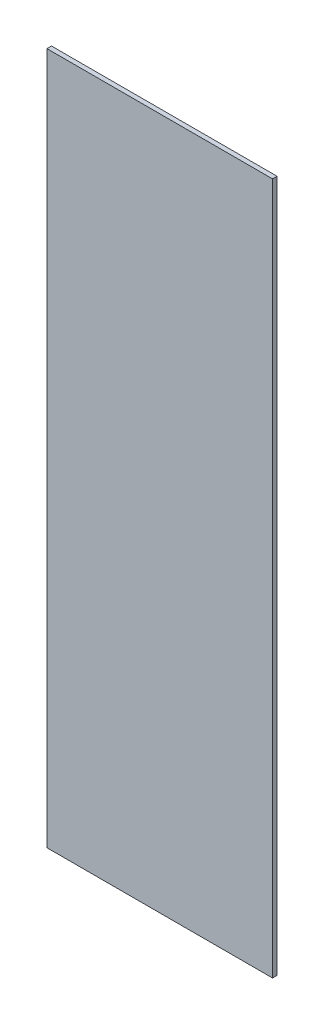
ISO-10303-21;
HEADER;
FILE_DESCRIPTION(('STEP AP214'),'2;1');
FILE_NAME('part.step','',(''),(''),'','','');
FILE_SCHEMA(('AUTOMOTIVE_DESIGN { 1 0 10303 214 1 1 1 1 }'));
ENDSEC;
DATA;
#1=APPLICATION_CONTEXT('core data for automotive mechanical design processes');
#2=APPLICATION_PROTOCOL_DEFINITION('international standard','automotive_design',2000,#1);
#3=PRODUCT_CONTEXT('',#1,'mechanical');
#4=PRODUCT('Part','Part','',(#3));
#5=PRODUCT_RELATED_PRODUCT_CATEGORY('part','',(#4));
#6=PRODUCT_DEFINITION_FORMATION('','',#4);
#7=PRODUCT_DEFINITION_CONTEXT('part definition',#1,'design');
#8=PRODUCT_DEFINITION('design','',#6,#7);
#9=PRODUCT_DEFINITION_SHAPE('','',#8);
#10=(LENGTH_UNIT() NAMED_UNIT(*) SI_UNIT(.MILLI.,.METRE.));
#11=(NAMED_UNIT(*) PLANE_ANGLE_UNIT() SI_UNIT($,.RADIAN.));
#12=(NAMED_UNIT(*) SI_UNIT($,.STERADIAN.) SOLID_ANGLE_UNIT());
#13=UNCERTAINTY_MEASURE_WITH_UNIT(LENGTH_MEASURE(1.E-05),#10,'distance_accuracy_value','');
#14=(GEOMETRIC_REPRESENTATION_CONTEXT(3) GLOBAL_UNCERTAINTY_ASSIGNED_CONTEXT((#13)) GLOBAL_UNIT_ASSIGNED_CONTEXT((#10,
#11,#12)) REPRESENTATION_CONTEXT('',''));
#15=CARTESIAN_POINT('',(0.,0.,0.));
#16=DIRECTION('',(0.,0.,1.));
#17=DIRECTION('',(1.,0.,0.));
#18=AXIS2_PLACEMENT_3D('',#15,#16,#17);
#19=CARTESIAN_POINT('',(-2.67363903133019,-122.025902502347,1.5875));
#20=DIRECTION('',(0.,1.,0.));
#21=DIRECTION('',(0.,0.,1.));
#22=AXIS2_PLACEMENT_3D('',#19,#20,#21);
#23=PLANE('',#22);
#24=DIRECTION('',(1.,0.,0.));
#25=VECTOR('',#24,1.);
#26=CARTESIAN_POINT('',(-2.67363903133019,-122.025902502347,0.));
#27=LINE('',#26,#25);
#28=CARTESIAN_POINT('',(-2.67363903133019,-122.025902502347,0.));
#29=VERTEX_POINT('',#28);
#30=CARTESIAN_POINT('',(76.2138610546698,-122.025902502347,0.));
#31=VERTEX_POINT('',#30);
#32=EDGE_CURVE('E99',#29,#31,#27,.T.);
#33=ORIENTED_EDGE('',*,*,#32,.T.);
#34=DIRECTION('',(0.,0.,-1.));
#35=VECTOR('',#34,1.);
#36=CARTESIAN_POINT('',(76.2138610546698,-122.025902502347,1.5875));
#37=LINE('',#36,#35);
#38=CARTESIAN_POINT('',(76.2138610546698,-122.025902502347,1.5875));
#39=VERTEX_POINT('',#38);
#40=EDGE_CURVE('E11',#39,#31,#37,.T.);
#41=ORIENTED_EDGE('',*,*,#40,.F.);
#42=DIRECTION('',(1.,0.,0.));
#43=VECTOR('',#42,1.);
#44=CARTESIAN_POINT('',(-2.67363903133019,-122.025902502347,1.5875));
#45=LINE('',#44,#43);
#46=CARTESIAN_POINT('',(-2.67363903133019,-122.025902502347,1.5875));
#47=VERTEX_POINT('',#46);
#48=EDGE_CURVE('E87',#47,#39,#45,.T.);
#49=ORIENTED_EDGE('',*,*,#48,.F.);
#50=DIRECTION('',(0.,0.,-1.));
#51=VECTOR('',#50,1.);
#52=CARTESIAN_POINT('',(-2.67363903133019,-122.025902502347,1.5875));
#53=LINE('',#52,#51);
#54=EDGE_CURVE('E95',#47,#29,#53,.T.);
#55=ORIENTED_EDGE('',*,*,#54,.T.);
#56=EDGE_LOOP('',(#33,#41,#49,#55));
#57=FACE_BOUND('',#56,.T.);
#58=ADVANCED_FACE('F36',(#57),#23,.F.);
#59=CARTESIAN_POINT('',(76.2138610546698,120.034097501655,1.5875));
#60=DIRECTION('',(-1.,0.,0.));
#61=DIRECTION('',(0.,-1.,0.));
#62=AXIS2_PLACEMENT_3D('',#59,#60,#61);
#63=PLANE('',#62);
#64=DIRECTION('',(0.,1.,0.));
#65=VECTOR('',#64,1.);
#66=CARTESIAN_POINT('',(76.2138610546698,120.034097501655,0.));
#67=LINE('',#66,#65);
#68=CARTESIAN_POINT('',(76.2138610546698,120.034097501655,0.));
#69=VERTEX_POINT('',#68);
#70=EDGE_CURVE('E91',#31,#69,#67,.T.);
#71=ORIENTED_EDGE('',*,*,#70,.T.);
#72=DIRECTION('',(0.,0.,-1.));
#73=VECTOR('',#72,1.);
#74=CARTESIAN_POINT('',(76.2138610546698,120.034097501655,1.5875));
#75=LINE('',#74,#73);
#76=CARTESIAN_POINT('',(76.2138610546698,120.034097501655,1.5875));
#77=VERTEX_POINT('',#76);
#78=EDGE_CURVE('E44',#77,#69,#75,.T.);
#79=ORIENTED_EDGE('',*,*,#78,.F.);
#80=DIRECTION('',(0.,1.,0.));
#81=VECTOR('',#80,1.);
#82=CARTESIAN_POINT('',(76.2138610546698,120.034097501655,1.5875));
#83=LINE('',#82,#81);
#84=EDGE_CURVE('E82',#39,#77,#83,.T.);
#85=ORIENTED_EDGE('',*,*,#84,.F.);
#86=ORIENTED_EDGE('',*,*,#40,.T.);
#87=EDGE_LOOP('',(#71,#79,#85,#86));
#88=FACE_BOUND('',#87,.T.);
#89=ADVANCED_FACE('F90',(#88),#63,.F.);
#90=CARTESIAN_POINT('',(-2.67363903133022,120.034097501655,1.5875));
#91=DIRECTION('',(0.,-1.,0.));
#92=DIRECTION('',(0.,0.,-1.));
#93=AXIS2_PLACEMENT_3D('',#90,#91,#92);
#94=PLANE('',#93);
#95=DIRECTION('',(-1.,0.,0.));
#96=VECTOR('',#95,1.);
#97=CARTESIAN_POINT('',(-2.67363903133022,120.034097501655,0.));
#98=LINE('',#97,#96);
#99=CARTESIAN_POINT('',(-2.67363903133022,120.034097501655,0.));
#100=VERTEX_POINT('',#99);
#101=EDGE_CURVE('E69',#69,#100,#98,.T.);
#102=ORIENTED_EDGE('',*,*,#101,.T.);
#103=DIRECTION('',(0.,0.,-1.));
#104=VECTOR('',#103,1.);
#105=CARTESIAN_POINT('',(-2.67363903133022,120.034097501655,1.5875));
#106=LINE('',#105,#104);
#107=CARTESIAN_POINT('',(-2.67363903133022,120.034097501655,1.5875));
#108=VERTEX_POINT('',#107);
#109=EDGE_CURVE('E92',#108,#100,#106,.T.);
#110=ORIENTED_EDGE('',*,*,#109,.F.);
#111=DIRECTION('',(-1.,0.,0.));
#112=VECTOR('',#111,1.);
#113=CARTESIAN_POINT('',(-2.67363903133022,120.034097501655,1.5875));
#114=LINE('',#113,#112);
#115=EDGE_CURVE('E85',#77,#108,#114,.T.);
#116=ORIENTED_EDGE('',*,*,#115,.F.);
#117=ORIENTED_EDGE('',*,*,#78,.T.);
#118=EDGE_LOOP('',(#102,#110,#116,#117));
#119=FACE_BOUND('',#118,.T.);
#120=ADVANCED_FACE('F93',(#119),#94,.F.);
#121=CARTESIAN_POINT('',(-2.67363903133022,120.034097501655,1.5875));
#122=DIRECTION('',(1.,0.,0.));
#123=DIRECTION('',(0.,1.,0.));
#124=AXIS2_PLACEMENT_3D('',#121,#122,#123);
#125=PLANE('',#124);
#126=DIRECTION('',(0.,-1.,0.));
#127=VECTOR('',#126,1.);
#128=CARTESIAN_POINT('',(-2.67363903133022,120.034097501655,0.));
#129=LINE('',#128,#127);
#130=EDGE_CURVE('E75',#100,#29,#129,.T.);
#131=ORIENTED_EDGE('',*,*,#130,.T.);
#132=ORIENTED_EDGE('',*,*,#54,.F.);
#133=DIRECTION('',(0.,-1.,0.));
#134=VECTOR('',#133,1.);
#135=CARTESIAN_POINT('',(-2.67363903133022,120.034097501655,1.5875));
#136=LINE('',#135,#134);
#137=EDGE_CURVE('E52',#108,#47,#136,.T.);
#138=ORIENTED_EDGE('',*,*,#137,.F.);
#139=ORIENTED_EDGE('',*,*,#109,.T.);
#140=EDGE_LOOP('',(#131,#132,#138,#139));
#141=FACE_BOUND('',#140,.T.);
#142=ADVANCED_FACE('F106',(#141),#125,.F.);
#143=CARTESIAN_POINT('',(0.,0.,1.5875));
#144=DIRECTION('',(0.,0.,-1.));
#145=DIRECTION('',(-1.,0.,0.));
#146=AXIS2_PLACEMENT_3D('',#143,#144,#145);
#147=PLANE('',#146);
#148=ORIENTED_EDGE('',*,*,#48,.T.);
#149=ORIENTED_EDGE('',*,*,#84,.T.);
#150=ORIENTED_EDGE('',*,*,#115,.T.);
#151=ORIENTED_EDGE('',*,*,#137,.T.);
#152=EDGE_LOOP('',(#148,#149,#150,#151));
#153=FACE_BOUND('',#152,.T.);
#154=ADVANCED_FACE('F83',(#153),#147,.F.);
#155=CARTESIAN_POINT('',(0.,0.,0.));
#156=DIRECTION('',(0.,0.,-1.));
#157=DIRECTION('',(-1.,0.,0.));
#158=AXIS2_PLACEMENT_3D('',#155,#156,#157);
#159=PLANE('',#158);
#160=ORIENTED_EDGE('',*,*,#32,.F.);
#161=ORIENTED_EDGE('',*,*,#130,.F.);
#162=ORIENTED_EDGE('',*,*,#101,.F.);
#163=ORIENTED_EDGE('',*,*,#70,.F.);
#164=EDGE_LOOP('',(#160,#161,#162,#163));
#165=FACE_BOUND('',#164,.T.);
#166=ADVANCED_FACE('F109',(#165),#159,.T.);
#167=CLOSED_SHELL('',(#58,#89,#120,#142,#154,#166));
#168=MANIFOLD_SOLID_BREP('B2',#167);
#169=ADVANCED_BREP_SHAPE_REPRESENTATION('',(#18,#168),#14);
#170=SHAPE_DEFINITION_REPRESENTATION(#9,#169);
ENDSEC;
END-ISO-10303-21;
